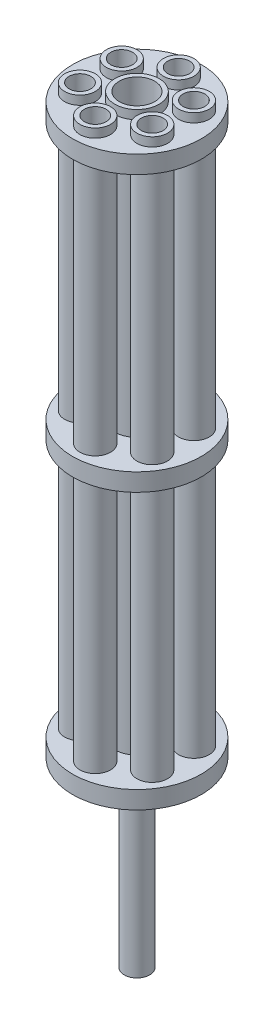
ISO-10303-21;
HEADER;
FILE_DESCRIPTION(('STEP AP214'),'2;1');
FILE_NAME('part.step','',(''),(''),'','','');
FILE_SCHEMA(('AUTOMOTIVE_DESIGN { 1 0 10303 214 1 1 1 1 }'));
ENDSEC;
DATA;
#1=APPLICATION_CONTEXT('core data for automotive mechanical design processes');
#2=APPLICATION_PROTOCOL_DEFINITION('international standard','automotive_design',2000,#1);
#3=PRODUCT_CONTEXT('',#1,'mechanical');
#4=PRODUCT('Part','Part','',(#3));
#5=PRODUCT_RELATED_PRODUCT_CATEGORY('part','',(#4));
#6=PRODUCT_DEFINITION_FORMATION('','',#4);
#7=PRODUCT_DEFINITION_CONTEXT('part definition',#1,'design');
#8=PRODUCT_DEFINITION('design','',#6,#7);
#9=PRODUCT_DEFINITION_SHAPE('','',#8);
#10=(LENGTH_UNIT() NAMED_UNIT(*) SI_UNIT(.MILLI.,.METRE.));
#11=(NAMED_UNIT(*) PLANE_ANGLE_UNIT() SI_UNIT($,.RADIAN.));
#12=(NAMED_UNIT(*) SI_UNIT($,.STERADIAN.) SOLID_ANGLE_UNIT());
#13=UNCERTAINTY_MEASURE_WITH_UNIT(LENGTH_MEASURE(1.E-05),#10,'distance_accuracy_value','');
#14=(GEOMETRIC_REPRESENTATION_CONTEXT(3) GLOBAL_UNCERTAINTY_ASSIGNED_CONTEXT((#13)) GLOBAL_UNIT_ASSIGNED_CONTEXT((#10,
#11,#12)) REPRESENTATION_CONTEXT('',''));
#15=CARTESIAN_POINT('',(0.,0.,0.));
#16=DIRECTION('',(0.,0.,1.));
#17=DIRECTION('',(1.,0.,0.));
#18=AXIS2_PLACEMENT_3D('',#15,#16,#17);
#19=CARTESIAN_POINT('',(0.,-120.,0.));
#20=DIRECTION('',(0.,1.,0.));
#21=DIRECTION('',(0.,0.,1.));
#22=AXIS2_PLACEMENT_3D('',#19,#20,#21);
#23=PLANE('',#22);
#24=CARTESIAN_POINT('',(0.,-120.,0.));
#25=DIRECTION('',(0.,1.,0.));
#26=DIRECTION('',(0.,0.,1.));
#27=AXIS2_PLACEMENT_3D('',#24,#25,#26);
#28=CIRCLE('',#27,4.);
#29=CARTESIAN_POINT('',(0.,-120.,4.));
#30=VERTEX_POINT('',#29);
#31=EDGE_CURVE('E126',#30,#30,#28,.F.);
#32=ORIENTED_EDGE('',*,*,#31,.F.);
#33=EDGE_LOOP('',(#32));
#34=FACE_BOUND('',#33,.T.);
#35=ADVANCED_FACE('F42',(#34),#23,.T.);
#36=CARTESIAN_POINT('',(0.,-121.,0.));
#37=DIRECTION('',(0.,1.,0.));
#38=DIRECTION('',(0.,0.,1.));
#39=AXIS2_PLACEMENT_3D('',#36,#37,#38);
#40=CYLINDRICAL_SURFACE('',#39,4.);
#41=ORIENTED_EDGE('',*,*,#31,.T.);
#42=EDGE_LOOP('',(#41));
#43=FACE_BOUND('',#42,.T.);
#44=CARTESIAN_POINT('',(0.,6.,0.));
#45=DIRECTION('',(0.,1.,0.));
#46=DIRECTION('',(0.,0.,1.));
#47=AXIS2_PLACEMENT_3D('',#44,#45,#46);
#48=CIRCLE('',#47,4.);
#49=CARTESIAN_POINT('',(0.,6.,4.));
#50=VERTEX_POINT('',#49);
#51=EDGE_CURVE('E303',#50,#50,#48,.T.);
#52=ORIENTED_EDGE('',*,*,#51,.T.);
#53=EDGE_LOOP('',(#52));
#54=FACE_BOUND('',#53,.T.);
#55=ADVANCED_FACE('F371',(#43,#54),#40,.F.);
#56=CARTESIAN_POINT('',(0.,4.,0.));
#57=DIRECTION('',(0.,-1.,0.));
#58=DIRECTION('',(0.,0.,-1.));
#59=AXIS2_PLACEMENT_3D('',#56,#57,#58);
#60=CYLINDRICAL_SURFACE('',#59,14.5);
#61=CARTESIAN_POINT('',(0.,4.,0.));
#62=DIRECTION('',(0.,1.,0.));
#63=DIRECTION('',(0.,0.,1.));
#64=AXIS2_PLACEMENT_3D('',#61,#62,#63);
#65=CIRCLE('',#64,14.5);
#66=CARTESIAN_POINT('',(0.,4.,14.5));
#67=VERTEX_POINT('',#66);
#68=EDGE_CURVE('E315',#67,#67,#65,.T.);
#69=ORIENTED_EDGE('',*,*,#68,.F.);
#70=EDGE_LOOP('',(#69));
#71=FACE_BOUND('',#70,.T.);
#72=CARTESIAN_POINT('',(0.,0.,0.));
#73=DIRECTION('',(0.,1.,0.));
#74=DIRECTION('',(0.,0.,1.));
#75=AXIS2_PLACEMENT_3D('',#72,#73,#74);
#76=CIRCLE('',#75,14.5);
#77=CARTESIAN_POINT('',(0.,0.,14.5));
#78=VERTEX_POINT('',#77);
#79=EDGE_CURVE('E319',#78,#78,#76,.T.);
#80=ORIENTED_EDGE('',*,*,#79,.T.);
#81=EDGE_LOOP('',(#80));
#82=FACE_BOUND('',#81,.T.);
#83=ADVANCED_FACE('F44',(#71,#82),#60,.T.);
#84=CARTESIAN_POINT('',(0.,4.,0.));
#85=DIRECTION('',(0.,1.,0.));
#86=DIRECTION('',(0.,0.,1.));
#87=AXIS2_PLACEMENT_3D('',#84,#85,#86);
#88=PLANE('',#87);
#89=CARTESIAN_POINT('',(-8.14063879557373,4.,-4.69999999999999));
#90=DIRECTION('',(0.,1.,0.));
#91=DIRECTION('',(0.,0.,1.));
#92=AXIS2_PLACEMENT_3D('',#89,#90,#91);
#93=CIRCLE('',#92,3.45389241373698);
#94=CARTESIAN_POINT('',(-8.14063879557373,4.,-1.24610758626301));
#95=VERTEX_POINT('',#94);
#96=EDGE_CURVE('E203',#95,#95,#93,.T.);
#97=ORIENTED_EDGE('',*,*,#96,.F.);
#98=EDGE_LOOP('',(#97));
#99=FACE_BOUND('',#98,.T.);
#100=CARTESIAN_POINT('',(-8.14063879557372,4.,4.7));
#101=DIRECTION('',(0.,1.,0.));
#102=DIRECTION('',(0.,0.,1.));
#103=AXIS2_PLACEMENT_3D('',#100,#101,#102);
#104=CIRCLE('',#103,3.45389241373698);
#105=CARTESIAN_POINT('',(-8.14063879557372,4.,8.15389241373698));
#106=VERTEX_POINT('',#105);
#107=EDGE_CURVE('E237',#106,#106,#104,.T.);
#108=ORIENTED_EDGE('',*,*,#107,.F.);
#109=EDGE_LOOP('',(#108));
#110=FACE_BOUND('',#109,.T.);
#111=CARTESIAN_POINT('',(0.,4.,9.4));
#112=DIRECTION('',(0.,1.,0.));
#113=DIRECTION('',(0.,0.,1.));
#114=AXIS2_PLACEMENT_3D('',#111,#112,#113);
#115=CIRCLE('',#114,3.45389241373698);
#116=CARTESIAN_POINT('',(0.,4.,12.853892413737));
#117=VERTEX_POINT('',#116);
#118=EDGE_CURVE('E250',#117,#117,#115,.T.);
#119=ORIENTED_EDGE('',*,*,#118,.F.);
#120=EDGE_LOOP('',(#119));
#121=FACE_BOUND('',#120,.T.);
#122=CARTESIAN_POINT('',(8.14063879557373,4.,4.7));
#123=DIRECTION('',(0.,1.,0.));
#124=DIRECTION('',(0.,0.,1.));
#125=AXIS2_PLACEMENT_3D('',#122,#123,#124);
#126=CIRCLE('',#125,3.45389241373698);
#127=CARTESIAN_POINT('',(8.14063879557373,4.,8.15389241373698));
#128=VERTEX_POINT('',#127);
#129=EDGE_CURVE('E263',#128,#128,#126,.T.);
#130=ORIENTED_EDGE('',*,*,#129,.F.);
#131=EDGE_LOOP('',(#130));
#132=FACE_BOUND('',#131,.T.);
#133=CARTESIAN_POINT('',(8.14063879557373,4.,-4.70000000000001));
#134=DIRECTION('',(0.,1.,0.));
#135=DIRECTION('',(0.,0.,1.));
#136=AXIS2_PLACEMENT_3D('',#133,#134,#135);
#137=CIRCLE('',#136,3.45389241373698);
#138=CARTESIAN_POINT('',(8.14063879557373,4.,-1.24610758626303));
#139=VERTEX_POINT('',#138);
#140=EDGE_CURVE('E276',#139,#139,#137,.T.);
#141=ORIENTED_EDGE('',*,*,#140,.F.);
#142=EDGE_LOOP('',(#141));
#143=FACE_BOUND('',#142,.T.);
#144=CARTESIAN_POINT('',(0.,4.,-9.4));
#145=DIRECTION('',(0.,1.,0.));
#146=DIRECTION('',(0.,0.,1.));
#147=AXIS2_PLACEMENT_3D('',#144,#145,#146);
#148=CIRCLE('',#147,3.45389241373698);
#149=CARTESIAN_POINT('',(0.,4.,-5.94610758626302));
#150=VERTEX_POINT('',#149);
#151=EDGE_CURVE('E289',#150,#150,#148,.T.);
#152=ORIENTED_EDGE('',*,*,#151,.F.);
#153=EDGE_LOOP('',(#152));
#154=FACE_BOUND('',#153,.T.);
#155=CARTESIAN_POINT('',(0.,4.,0.));
#156=DIRECTION('',(0.,1.,0.));
#157=DIRECTION('',(0.,0.,1.));
#158=AXIS2_PLACEMENT_3D('',#155,#156,#157);
#159=CIRCLE('',#158,5.);
#160=CARTESIAN_POINT('',(0.,4.,5.));
#161=VERTEX_POINT('',#160);
#162=EDGE_CURVE('E302',#161,#161,#159,.T.);
#163=ORIENTED_EDGE('',*,*,#162,.F.);
#164=EDGE_LOOP('',(#163));
#165=FACE_BOUND('',#164,.T.);
#166=ORIENTED_EDGE('',*,*,#68,.T.);
#167=EDGE_LOOP('',(#166));
#168=FACE_BOUND('',#167,.T.);
#169=ADVANCED_FACE('F461',(#99,#110,#121,#132,#143,#154,#165,#168),#88,.T.);
#170=CARTESIAN_POINT('',(0.,0.,0.));
#171=DIRECTION('',(0.,1.,0.));
#172=DIRECTION('',(0.,0.,1.));
#173=AXIS2_PLACEMENT_3D('',#170,#171,#172);
#174=PLANE('',#173);
#175=CARTESIAN_POINT('',(-8.14063879557373,0.,-4.69999999999999));
#176=DIRECTION('',(0.,1.,0.));
#177=DIRECTION('',(0.,0.,1.));
#178=AXIS2_PLACEMENT_3D('',#175,#176,#177);
#179=CIRCLE('',#178,3.45389241373698);
#180=CARTESIAN_POINT('',(-8.14063879557373,0.,-1.24610758626301));
#181=VERTEX_POINT('',#180);
#182=EDGE_CURVE('E233',#181,#181,#179,.T.);
#183=ORIENTED_EDGE('',*,*,#182,.T.);
#184=EDGE_LOOP('',(#183));
#185=FACE_BOUND('',#184,.T.);
#186=CARTESIAN_POINT('',(-8.14063879557372,0.,4.7));
#187=DIRECTION('',(0.,1.,0.));
#188=DIRECTION('',(0.,0.,1.));
#189=AXIS2_PLACEMENT_3D('',#186,#187,#188);
#190=CIRCLE('',#189,3.45389241373698);
#191=CARTESIAN_POINT('',(-8.14063879557372,0.,8.15389241373698));
#192=VERTEX_POINT('',#191);
#193=EDGE_CURVE('E246',#192,#192,#190,.T.);
#194=ORIENTED_EDGE('',*,*,#193,.T.);
#195=EDGE_LOOP('',(#194));
#196=FACE_BOUND('',#195,.T.);
#197=CARTESIAN_POINT('',(0.,0.,9.4));
#198=DIRECTION('',(0.,1.,0.));
#199=DIRECTION('',(0.,0.,1.));
#200=AXIS2_PLACEMENT_3D('',#197,#198,#199);
#201=CIRCLE('',#200,3.45389241373698);
#202=CARTESIAN_POINT('',(0.,0.,12.853892413737));
#203=VERTEX_POINT('',#202);
#204=EDGE_CURVE('E259',#203,#203,#201,.T.);
#205=ORIENTED_EDGE('',*,*,#204,.T.);
#206=EDGE_LOOP('',(#205));
#207=FACE_BOUND('',#206,.T.);
#208=CARTESIAN_POINT('',(8.14063879557373,0.,4.7));
#209=DIRECTION('',(0.,1.,0.));
#210=DIRECTION('',(0.,0.,1.));
#211=AXIS2_PLACEMENT_3D('',#208,#209,#210);
#212=CIRCLE('',#211,3.45389241373698);
#213=CARTESIAN_POINT('',(8.14063879557373,0.,8.15389241373698));
#214=VERTEX_POINT('',#213);
#215=EDGE_CURVE('E272',#214,#214,#212,.T.);
#216=ORIENTED_EDGE('',*,*,#215,.T.);
#217=EDGE_LOOP('',(#216));
#218=FACE_BOUND('',#217,.T.);
#219=CARTESIAN_POINT('',(8.14063879557373,0.,-4.70000000000001));
#220=DIRECTION('',(0.,1.,0.));
#221=DIRECTION('',(0.,0.,1.));
#222=AXIS2_PLACEMENT_3D('',#219,#220,#221);
#223=CIRCLE('',#222,3.45389241373698);
#224=CARTESIAN_POINT('',(8.14063879557373,0.,-1.24610758626303));
#225=VERTEX_POINT('',#224);
#226=EDGE_CURVE('E285',#225,#225,#223,.T.);
#227=ORIENTED_EDGE('',*,*,#226,.T.);
#228=EDGE_LOOP('',(#227));
#229=FACE_BOUND('',#228,.T.);
#230=CARTESIAN_POINT('',(0.,0.,-9.4));
#231=DIRECTION('',(0.,1.,0.));
#232=DIRECTION('',(0.,0.,1.));
#233=AXIS2_PLACEMENT_3D('',#230,#231,#232);
#234=CIRCLE('',#233,3.45389241373698);
#235=CARTESIAN_POINT('',(0.,0.,-5.94610758626302));
#236=VERTEX_POINT('',#235);
#237=EDGE_CURVE('E298',#236,#236,#234,.T.);
#238=ORIENTED_EDGE('',*,*,#237,.T.);
#239=EDGE_LOOP('',(#238));
#240=FACE_BOUND('',#239,.T.);
#241=CARTESIAN_POINT('',(0.,0.,0.));
#242=DIRECTION('',(0.,1.,0.));
#243=DIRECTION('',(0.,0.,1.));
#244=AXIS2_PLACEMENT_3D('',#241,#242,#243);
#245=CIRCLE('',#244,5.);
#246=CARTESIAN_POINT('',(0.,0.,5.));
#247=VERTEX_POINT('',#246);
#248=EDGE_CURVE('E311',#247,#247,#245,.T.);
#249=ORIENTED_EDGE('',*,*,#248,.T.);
#250=EDGE_LOOP('',(#249));
#251=FACE_BOUND('',#250,.T.);
#252=ORIENTED_EDGE('',*,*,#79,.F.);
#253=EDGE_LOOP('',(#252));
#254=FACE_BOUND('',#253,.T.);
#255=ADVANCED_FACE('F344',(#185,#196,#207,#218,#229,#240,#251,#254),#174,.F.);
#256=CARTESIAN_POINT('',(0.,-121.,0.));
#257=DIRECTION('',(0.,1.,0.));
#258=DIRECTION('',(0.,0.,1.));
#259=AXIS2_PLACEMENT_3D('',#256,#257,#258);
#260=CYLINDRICAL_SURFACE('',#259,5.);
#261=CARTESIAN_POINT('',(0.,-58.,0.));
#262=DIRECTION('',(0.,1.,0.));
#263=DIRECTION('',(0.,0.,1.));
#264=AXIS2_PLACEMENT_3D('',#261,#262,#263);
#265=CIRCLE('',#264,5.);
#266=CARTESIAN_POINT('',(0.,-58.,5.));
#267=VERTEX_POINT('',#266);
#268=EDGE_CURVE('E135',#267,#267,#265,.F.);
#269=ORIENTED_EDGE('',*,*,#268,.F.);
#270=EDGE_LOOP('',(#269));
#271=FACE_BOUND('',#270,.T.);
#272=ORIENTED_EDGE('',*,*,#248,.F.);
#273=EDGE_LOOP('',(#272));
#274=FACE_BOUND('',#273,.T.);
#275=ADVANCED_FACE('F460',(#271,#274),#260,.T.);
#276=ORIENTED_EDGE('',*,*,#162,.T.);
#277=EDGE_LOOP('',(#276));
#278=FACE_BOUND('',#277,.T.);
#279=CARTESIAN_POINT('',(0.,6.,0.));
#280=DIRECTION('',(0.,1.,0.));
#281=DIRECTION('',(0.,0.,1.));
#282=AXIS2_PLACEMENT_3D('',#279,#280,#281);
#283=CIRCLE('',#282,5.);
#284=CARTESIAN_POINT('',(0.,6.,5.));
#285=VERTEX_POINT('',#284);
#286=EDGE_CURVE('E307',#285,#285,#283,.T.);
#287=ORIENTED_EDGE('',*,*,#286,.F.);
#288=EDGE_LOOP('',(#287));
#289=FACE_BOUND('',#288,.T.);
#290=ADVANCED_FACE('F488',(#278,#289),#260,.T.);
#291=CARTESIAN_POINT('',(0.,6.,0.));
#292=DIRECTION('',(0.,1.,0.));
#293=DIRECTION('',(0.,0.,1.));
#294=AXIS2_PLACEMENT_3D('',#291,#292,#293);
#295=PLANE('',#294);
#296=ORIENTED_EDGE('',*,*,#286,.T.);
#297=EDGE_LOOP('',(#296));
#298=FACE_BOUND('',#297,.T.);
#299=ORIENTED_EDGE('',*,*,#51,.F.);
#300=EDGE_LOOP('',(#299));
#301=FACE_BOUND('',#300,.T.);
#302=ADVANCED_FACE('F490',(#298,#301),#295,.T.);
#303=CARTESIAN_POINT('',(0.,-121.,-9.4));
#304=DIRECTION('',(0.,1.,0.));
#305=DIRECTION('',(0.,0.,1.));
#306=AXIS2_PLACEMENT_3D('',#303,#304,#305);
#307=CYLINDRICAL_SURFACE('',#306,3.45389241373698);
#308=CARTESIAN_POINT('',(0.,-58.,-9.4));
#309=DIRECTION('',(0.,1.,0.));
#310=DIRECTION('',(0.,0.,1.));
#311=AXIS2_PLACEMENT_3D('',#308,#309,#310);
#312=CIRCLE('',#311,3.45389241373698);
#313=CARTESIAN_POINT('',(0.,-58.,-5.94610758626302));
#314=VERTEX_POINT('',#313);
#315=EDGE_CURVE('E219',#314,#314,#312,.F.);
#316=ORIENTED_EDGE('',*,*,#315,.F.);
#317=EDGE_LOOP('',(#316));
#318=FACE_BOUND('',#317,.T.);
#319=ORIENTED_EDGE('',*,*,#237,.F.);
#320=EDGE_LOOP('',(#319));
#321=FACE_BOUND('',#320,.T.);
#322=ADVANCED_FACE('F495',(#318,#321),#307,.T.);
#323=ORIENTED_EDGE('',*,*,#151,.T.);
#324=EDGE_LOOP('',(#323));
#325=FACE_BOUND('',#324,.T.);
#326=CARTESIAN_POINT('',(0.,6.,-9.4));
#327=DIRECTION('',(0.,1.,0.));
#328=DIRECTION('',(0.,0.,1.));
#329=AXIS2_PLACEMENT_3D('',#326,#327,#328);
#330=CIRCLE('',#329,3.45389241373698);
#331=CARTESIAN_POINT('',(0.,6.,-5.94610758626302));
#332=VERTEX_POINT('',#331);
#333=EDGE_CURVE('E290',#332,#332,#330,.T.);
#334=ORIENTED_EDGE('',*,*,#333,.F.);
#335=EDGE_LOOP('',(#334));
#336=FACE_BOUND('',#335,.T.);
#337=ADVANCED_FACE('F501',(#325,#336),#307,.T.);
#338=CARTESIAN_POINT('',(0.,6.,-9.4));
#339=DIRECTION('',(0.,1.,0.));
#340=DIRECTION('',(0.,0.,1.));
#341=AXIS2_PLACEMENT_3D('',#338,#339,#340);
#342=PLANE('',#341);
#343=ORIENTED_EDGE('',*,*,#333,.T.);
#344=EDGE_LOOP('',(#343));
#345=FACE_BOUND('',#344,.T.);
#346=CARTESIAN_POINT('',(0.,6.,-9.4));
#347=DIRECTION('',(0.,1.,0.));
#348=DIRECTION('',(0.,0.,1.));
#349=AXIS2_PLACEMENT_3D('',#346,#347,#348);
#350=CIRCLE('',#349,2.45389241373698);
#351=CARTESIAN_POINT('',(0.,6.,-6.94610758626302));
#352=VERTEX_POINT('',#351);
#353=EDGE_CURVE('E294',#352,#352,#350,.T.);
#354=ORIENTED_EDGE('',*,*,#353,.F.);
#355=EDGE_LOOP('',(#354));
#356=FACE_BOUND('',#355,.T.);
#357=ADVANCED_FACE('F497',(#345,#356),#342,.T.);
#358=CARTESIAN_POINT('',(8.14063879557373,-121.,-4.70000000000001));
#359=DIRECTION('',(0.,1.,0.));
#360=DIRECTION('',(0.,0.,1.));
#361=AXIS2_PLACEMENT_3D('',#358,#359,#360);
#362=CYLINDRICAL_SURFACE('',#361,3.45389241373698);
#363=CARTESIAN_POINT('',(8.14063879557373,-58.,-4.70000000000001));
#364=DIRECTION('',(0.,1.,0.));
#365=DIRECTION('',(0.,0.,1.));
#366=AXIS2_PLACEMENT_3D('',#363,#364,#365);
#367=CIRCLE('',#366,3.45389241373698);
#368=CARTESIAN_POINT('',(8.14063879557373,-58.,-1.24610758626303));
#369=VERTEX_POINT('',#368);
#370=EDGE_CURVE('E215',#369,#369,#367,.F.);
#371=ORIENTED_EDGE('',*,*,#370,.F.);
#372=EDGE_LOOP('',(#371));
#373=FACE_BOUND('',#372,.T.);
#374=ORIENTED_EDGE('',*,*,#226,.F.);
#375=EDGE_LOOP('',(#374));
#376=FACE_BOUND('',#375,.T.);
#377=ADVANCED_FACE('F500',(#373,#376),#362,.T.);
#378=ORIENTED_EDGE('',*,*,#140,.T.);
#379=EDGE_LOOP('',(#378));
#380=FACE_BOUND('',#379,.T.);
#381=CARTESIAN_POINT('',(8.14063879557373,6.,-4.70000000000001));
#382=DIRECTION('',(0.,1.,0.));
#383=DIRECTION('',(0.,0.,1.));
#384=AXIS2_PLACEMENT_3D('',#381,#382,#383);
#385=CIRCLE('',#384,3.45389241373698);
#386=CARTESIAN_POINT('',(8.14063879557373,6.,-1.24610758626303));
#387=VERTEX_POINT('',#386);
#388=EDGE_CURVE('E277',#387,#387,#385,.T.);
#389=ORIENTED_EDGE('',*,*,#388,.F.);
#390=EDGE_LOOP('',(#389));
#391=FACE_BOUND('',#390,.T.);
#392=ADVANCED_FACE('F517',(#380,#391),#362,.T.);
#393=CARTESIAN_POINT('',(8.14063879557373,6.,-4.70000000000001));
#394=DIRECTION('',(0.,1.,0.));
#395=DIRECTION('',(0.,0.,1.));
#396=AXIS2_PLACEMENT_3D('',#393,#394,#395);
#397=PLANE('',#396);
#398=ORIENTED_EDGE('',*,*,#388,.T.);
#399=EDGE_LOOP('',(#398));
#400=FACE_BOUND('',#399,.T.);
#401=CARTESIAN_POINT('',(8.14063879557373,6.,-4.70000000000001));
#402=DIRECTION('',(0.,1.,0.));
#403=DIRECTION('',(0.,0.,1.));
#404=AXIS2_PLACEMENT_3D('',#401,#402,#403);
#405=CIRCLE('',#404,2.45389241373698);
#406=CARTESIAN_POINT('',(8.14063879557373,6.,-2.24610758626303));
#407=VERTEX_POINT('',#406);
#408=EDGE_CURVE('E281',#407,#407,#405,.T.);
#409=ORIENTED_EDGE('',*,*,#408,.F.);
#410=EDGE_LOOP('',(#409));
#411=FACE_BOUND('',#410,.T.);
#412=ADVANCED_FACE('F513',(#400,#411),#397,.T.);
#413=CARTESIAN_POINT('',(8.14063879557373,-121.,4.7));
#414=DIRECTION('',(0.,1.,0.));
#415=DIRECTION('',(0.,0.,1.));
#416=AXIS2_PLACEMENT_3D('',#413,#414,#415);
#417=CYLINDRICAL_SURFACE('',#416,3.45389241373698);
#418=CARTESIAN_POINT('',(8.14063879557373,-58.,4.7));
#419=DIRECTION('',(0.,1.,0.));
#420=DIRECTION('',(0.,0.,1.));
#421=AXIS2_PLACEMENT_3D('',#418,#419,#420);
#422=CIRCLE('',#421,3.45389241373698);
#423=CARTESIAN_POINT('',(8.14063879557373,-58.,8.15389241373698));
#424=VERTEX_POINT('',#423);
#425=EDGE_CURVE('E211',#424,#424,#422,.F.);
#426=ORIENTED_EDGE('',*,*,#425,.F.);
#427=EDGE_LOOP('',(#426));
#428=FACE_BOUND('',#427,.T.);
#429=ORIENTED_EDGE('',*,*,#215,.F.);
#430=EDGE_LOOP('',(#429));
#431=FACE_BOUND('',#430,.T.);
#432=ADVANCED_FACE('F516',(#428,#431),#417,.T.);
#433=ORIENTED_EDGE('',*,*,#129,.T.);
#434=EDGE_LOOP('',(#433));
#435=FACE_BOUND('',#434,.T.);
#436=CARTESIAN_POINT('',(8.14063879557373,6.,4.7));
#437=DIRECTION('',(0.,1.,0.));
#438=DIRECTION('',(0.,0.,1.));
#439=AXIS2_PLACEMENT_3D('',#436,#437,#438);
#440=CIRCLE('',#439,3.45389241373698);
#441=CARTESIAN_POINT('',(8.14063879557373,6.,8.15389241373698));
#442=VERTEX_POINT('',#441);
#443=EDGE_CURVE('E264',#442,#442,#440,.T.);
#444=ORIENTED_EDGE('',*,*,#443,.F.);
#445=EDGE_LOOP('',(#444));
#446=FACE_BOUND('',#445,.T.);
#447=ADVANCED_FACE('F531',(#435,#446),#417,.T.);
#448=CARTESIAN_POINT('',(8.14063879557373,6.,4.7));
#449=DIRECTION('',(0.,1.,0.));
#450=DIRECTION('',(0.,0.,1.));
#451=AXIS2_PLACEMENT_3D('',#448,#449,#450);
#452=PLANE('',#451);
#453=ORIENTED_EDGE('',*,*,#443,.T.);
#454=EDGE_LOOP('',(#453));
#455=FACE_BOUND('',#454,.T.);
#456=CARTESIAN_POINT('',(8.14063879557373,6.,4.7));
#457=DIRECTION('',(0.,1.,0.));
#458=DIRECTION('',(0.,0.,1.));
#459=AXIS2_PLACEMENT_3D('',#456,#457,#458);
#460=CIRCLE('',#459,2.45389241373698);
#461=CARTESIAN_POINT('',(8.14063879557373,6.,7.15389241373698));
#462=VERTEX_POINT('',#461);
#463=EDGE_CURVE('E268',#462,#462,#460,.T.);
#464=ORIENTED_EDGE('',*,*,#463,.F.);
#465=EDGE_LOOP('',(#464));
#466=FACE_BOUND('',#465,.T.);
#467=ADVANCED_FACE('F527',(#455,#466),#452,.T.);
#468=CARTESIAN_POINT('',(0.,-121.,9.4));
#469=DIRECTION('',(0.,1.,0.));
#470=DIRECTION('',(0.,0.,1.));
#471=AXIS2_PLACEMENT_3D('',#468,#469,#470);
#472=CYLINDRICAL_SURFACE('',#471,3.45389241373698);
#473=CARTESIAN_POINT('',(0.,-58.,9.4));
#474=DIRECTION('',(0.,1.,0.));
#475=DIRECTION('',(0.,0.,1.));
#476=AXIS2_PLACEMENT_3D('',#473,#474,#475);
#477=CIRCLE('',#476,3.45389241373698);
#478=CARTESIAN_POINT('',(0.,-58.,12.853892413737));
#479=VERTEX_POINT('',#478);
#480=EDGE_CURVE('E207',#479,#479,#477,.F.);
#481=ORIENTED_EDGE('',*,*,#480,.F.);
#482=EDGE_LOOP('',(#481));
#483=FACE_BOUND('',#482,.T.);
#484=ORIENTED_EDGE('',*,*,#204,.F.);
#485=EDGE_LOOP('',(#484));
#486=FACE_BOUND('',#485,.T.);
#487=ADVANCED_FACE('F530',(#483,#486),#472,.T.);
#488=ORIENTED_EDGE('',*,*,#118,.T.);
#489=EDGE_LOOP('',(#488));
#490=FACE_BOUND('',#489,.T.);
#491=CARTESIAN_POINT('',(0.,6.,9.4));
#492=DIRECTION('',(0.,1.,0.));
#493=DIRECTION('',(0.,0.,1.));
#494=AXIS2_PLACEMENT_3D('',#491,#492,#493);
#495=CIRCLE('',#494,3.45389241373698);
#496=CARTESIAN_POINT('',(0.,6.,12.853892413737));
#497=VERTEX_POINT('',#496);
#498=EDGE_CURVE('E251',#497,#497,#495,.T.);
#499=ORIENTED_EDGE('',*,*,#498,.F.);
#500=EDGE_LOOP('',(#499));
#501=FACE_BOUND('',#500,.T.);
#502=ADVANCED_FACE('F543',(#490,#501),#472,.T.);
#503=CARTESIAN_POINT('',(0.,6.,9.4));
#504=DIRECTION('',(0.,1.,0.));
#505=DIRECTION('',(0.,0.,1.));
#506=AXIS2_PLACEMENT_3D('',#503,#504,#505);
#507=PLANE('',#506);
#508=ORIENTED_EDGE('',*,*,#498,.T.);
#509=EDGE_LOOP('',(#508));
#510=FACE_BOUND('',#509,.T.);
#511=CARTESIAN_POINT('',(0.,6.,9.4));
#512=DIRECTION('',(0.,1.,0.));
#513=DIRECTION('',(0.,0.,1.));
#514=AXIS2_PLACEMENT_3D('',#511,#512,#513);
#515=CIRCLE('',#514,2.45389241373698);
#516=CARTESIAN_POINT('',(0.,6.,11.853892413737));
#517=VERTEX_POINT('',#516);
#518=EDGE_CURVE('E255',#517,#517,#515,.T.);
#519=ORIENTED_EDGE('',*,*,#518,.F.);
#520=EDGE_LOOP('',(#519));
#521=FACE_BOUND('',#520,.T.);
#522=ADVANCED_FACE('F456',(#510,#521),#507,.T.);
#523=CARTESIAN_POINT('',(-8.14063879557372,-121.,4.7));
#524=DIRECTION('',(0.,1.,0.));
#525=DIRECTION('',(0.,0.,1.));
#526=AXIS2_PLACEMENT_3D('',#523,#524,#525);
#527=CYLINDRICAL_SURFACE('',#526,3.45389241373698);
#528=CARTESIAN_POINT('',(-8.14063879557372,-58.,4.7));
#529=DIRECTION('',(0.,1.,0.));
#530=DIRECTION('',(0.,0.,1.));
#531=AXIS2_PLACEMENT_3D('',#528,#529,#530);
#532=CIRCLE('',#531,3.45389241373698);
#533=CARTESIAN_POINT('',(-8.14063879557372,-58.,8.15389241373698));
#534=VERTEX_POINT('',#533);
#535=EDGE_CURVE('E202',#534,#534,#532,.F.);
#536=ORIENTED_EDGE('',*,*,#535,.F.);
#537=EDGE_LOOP('',(#536));
#538=FACE_BOUND('',#537,.T.);
#539=ORIENTED_EDGE('',*,*,#193,.F.);
#540=EDGE_LOOP('',(#539));
#541=FACE_BOUND('',#540,.T.);
#542=ADVANCED_FACE('F434',(#538,#541),#527,.T.);
#543=ORIENTED_EDGE('',*,*,#107,.T.);
#544=EDGE_LOOP('',(#543));
#545=FACE_BOUND('',#544,.T.);
#546=CARTESIAN_POINT('',(-8.14063879557372,6.,4.7));
#547=DIRECTION('',(0.,1.,0.));
#548=DIRECTION('',(0.,0.,1.));
#549=AXIS2_PLACEMENT_3D('',#546,#547,#548);
#550=CIRCLE('',#549,3.45389241373698);
#551=CARTESIAN_POINT('',(-8.14063879557372,6.,8.15389241373698));
#552=VERTEX_POINT('',#551);
#553=EDGE_CURVE('E238',#552,#552,#550,.T.);
#554=ORIENTED_EDGE('',*,*,#553,.F.);
#555=EDGE_LOOP('',(#554));
#556=FACE_BOUND('',#555,.T.);
#557=ADVANCED_FACE('F360',(#545,#556),#527,.T.);
#558=CARTESIAN_POINT('',(-8.14063879557372,6.,4.7));
#559=DIRECTION('',(0.,1.,0.));
#560=DIRECTION('',(0.,0.,1.));
#561=AXIS2_PLACEMENT_3D('',#558,#559,#560);
#562=PLANE('',#561);
#563=ORIENTED_EDGE('',*,*,#553,.T.);
#564=EDGE_LOOP('',(#563));
#565=FACE_BOUND('',#564,.T.);
#566=CARTESIAN_POINT('',(-8.14063879557372,6.,4.7));
#567=DIRECTION('',(0.,1.,0.));
#568=DIRECTION('',(0.,0.,1.));
#569=AXIS2_PLACEMENT_3D('',#566,#567,#568);
#570=CIRCLE('',#569,2.45389241373698);
#571=CARTESIAN_POINT('',(-8.14063879557372,6.,7.15389241373698));
#572=VERTEX_POINT('',#571);
#573=EDGE_CURVE('E242',#572,#572,#570,.T.);
#574=ORIENTED_EDGE('',*,*,#573,.F.);
#575=EDGE_LOOP('',(#574));
#576=FACE_BOUND('',#575,.T.);
#577=ADVANCED_FACE('F350',(#565,#576),#562,.T.);
#578=CARTESIAN_POINT('',(-8.14063879557373,-121.,-4.69999999999999));
#579=DIRECTION('',(0.,1.,0.));
#580=DIRECTION('',(0.,0.,1.));
#581=AXIS2_PLACEMENT_3D('',#578,#579,#580);
#582=CYLINDRICAL_SURFACE('',#581,3.45389241373698);
#583=CARTESIAN_POINT('',(-8.14063879557373,-58.,-4.69999999999999));
#584=DIRECTION('',(0.,1.,0.));
#585=DIRECTION('',(0.,0.,1.));
#586=AXIS2_PLACEMENT_3D('',#583,#584,#585);
#587=CIRCLE('',#586,3.45389241373698);
#588=CARTESIAN_POINT('',(-8.14063879557373,-58.,-1.24610758626301));
#589=VERTEX_POINT('',#588);
#590=EDGE_CURVE('E198',#589,#589,#587,.F.);
#591=ORIENTED_EDGE('',*,*,#590,.F.);
#592=EDGE_LOOP('',(#591));
#593=FACE_BOUND('',#592,.T.);
#594=ORIENTED_EDGE('',*,*,#182,.F.);
#595=EDGE_LOOP('',(#594));
#596=FACE_BOUND('',#595,.T.);
#597=ADVANCED_FACE('F347',(#593,#596),#582,.T.);
#598=ORIENTED_EDGE('',*,*,#96,.T.);
#599=EDGE_LOOP('',(#598));
#600=FACE_BOUND('',#599,.T.);
#601=CARTESIAN_POINT('',(-8.14063879557373,6.,-4.69999999999999));
#602=DIRECTION('',(0.,1.,0.));
#603=DIRECTION('',(0.,0.,1.));
#604=AXIS2_PLACEMENT_3D('',#601,#602,#603);
#605=CIRCLE('',#604,3.45389241373698);
#606=CARTESIAN_POINT('',(-8.14063879557373,6.,-1.24610758626301));
#607=VERTEX_POINT('',#606);
#608=EDGE_CURVE('E197',#607,#607,#605,.T.);
#609=ORIENTED_EDGE('',*,*,#608,.F.);
#610=EDGE_LOOP('',(#609));
#611=FACE_BOUND('',#610,.T.);
#612=ADVANCED_FACE('F349',(#600,#611),#582,.T.);
#613=CARTESIAN_POINT('',(-8.14063879557373,6.,-4.69999999999999));
#614=DIRECTION('',(0.,1.,0.));
#615=DIRECTION('',(0.,0.,1.));
#616=AXIS2_PLACEMENT_3D('',#613,#614,#615);
#617=PLANE('',#616);
#618=ORIENTED_EDGE('',*,*,#608,.T.);
#619=EDGE_LOOP('',(#618));
#620=FACE_BOUND('',#619,.T.);
#621=CARTESIAN_POINT('',(-8.14063879557373,6.,-4.69999999999999));
#622=DIRECTION('',(0.,1.,0.));
#623=DIRECTION('',(0.,0.,1.));
#624=AXIS2_PLACEMENT_3D('',#621,#622,#623);
#625=CIRCLE('',#624,2.45389241373698);
#626=CARTESIAN_POINT('',(-8.14063879557373,6.,-2.24610758626301));
#627=VERTEX_POINT('',#626);
#628=EDGE_CURVE('E229',#627,#627,#625,.T.);
#629=ORIENTED_EDGE('',*,*,#628,.F.);
#630=EDGE_LOOP('',(#629));
#631=FACE_BOUND('',#630,.T.);
#632=ADVANCED_FACE('F358',(#620,#631),#617,.T.);
#633=CARTESIAN_POINT('',(0.,-62.,0.));
#634=DIRECTION('',(0.,1.,0.));
#635=DIRECTION('',(0.,0.,1.));
#636=AXIS2_PLACEMENT_3D('',#633,#634,#635);
#637=PLANE('',#636);
#638=CARTESIAN_POINT('',(0.,-62.,0.));
#639=DIRECTION('',(0.,1.,0.));
#640=DIRECTION('',(0.,0.,1.));
#641=AXIS2_PLACEMENT_3D('',#638,#639,#640);
#642=CIRCLE('',#641,5.);
#643=CARTESIAN_POINT('',(0.,-62.,5.));
#644=VERTEX_POINT('',#643);
#645=EDGE_CURVE('E193',#644,#644,#642,.F.);
#646=ORIENTED_EDGE('',*,*,#645,.F.);
#647=EDGE_LOOP('',(#646));
#648=FACE_BOUND('',#647,.T.);
#649=CARTESIAN_POINT('',(0.,-62.,-9.4));
#650=DIRECTION('',(0.,1.,0.));
#651=DIRECTION('',(0.,0.,1.));
#652=AXIS2_PLACEMENT_3D('',#649,#650,#651);
#653=CIRCLE('',#652,3.45389241373698);
#654=CARTESIAN_POINT('',(0.,-62.,-5.94610758626302));
#655=VERTEX_POINT('',#654);
#656=EDGE_CURVE('E189',#655,#655,#653,.F.);
#657=ORIENTED_EDGE('',*,*,#656,.F.);
#658=EDGE_LOOP('',(#657));
#659=FACE_BOUND('',#658,.T.);
#660=CARTESIAN_POINT('',(8.14063879557373,-62.,-4.70000000000001));
#661=DIRECTION('',(0.,1.,0.));
#662=DIRECTION('',(0.,0.,1.));
#663=AXIS2_PLACEMENT_3D('',#660,#661,#662);
#664=CIRCLE('',#663,3.45389241373698);
#665=CARTESIAN_POINT('',(8.14063879557373,-62.,-1.24610758626303));
#666=VERTEX_POINT('',#665);
#667=EDGE_CURVE('E185',#666,#666,#664,.F.);
#668=ORIENTED_EDGE('',*,*,#667,.F.);
#669=EDGE_LOOP('',(#668));
#670=FACE_BOUND('',#669,.T.);
#671=CARTESIAN_POINT('',(8.14063879557373,-62.,4.7));
#672=DIRECTION('',(0.,1.,0.));
#673=DIRECTION('',(0.,0.,1.));
#674=AXIS2_PLACEMENT_3D('',#671,#672,#673);
#675=CIRCLE('',#674,3.45389241373698);
#676=CARTESIAN_POINT('',(8.14063879557373,-62.,8.15389241373698));
#677=VERTEX_POINT('',#676);
#678=EDGE_CURVE('E181',#677,#677,#675,.F.);
#679=ORIENTED_EDGE('',*,*,#678,.F.);
#680=EDGE_LOOP('',(#679));
#681=FACE_BOUND('',#680,.T.);
#682=CARTESIAN_POINT('',(0.,-62.,9.4));
#683=DIRECTION('',(0.,1.,0.));
#684=DIRECTION('',(0.,0.,1.));
#685=AXIS2_PLACEMENT_3D('',#682,#683,#684);
#686=CIRCLE('',#685,3.45389241373698);
#687=CARTESIAN_POINT('',(0.,-62.,12.853892413737));
#688=VERTEX_POINT('',#687);
#689=EDGE_CURVE('E177',#688,#688,#686,.F.);
#690=ORIENTED_EDGE('',*,*,#689,.F.);
#691=EDGE_LOOP('',(#690));
#692=FACE_BOUND('',#691,.T.);
#693=CARTESIAN_POINT('',(-8.14063879557372,-62.,4.7));
#694=DIRECTION('',(0.,1.,0.));
#695=DIRECTION('',(0.,0.,1.));
#696=AXIS2_PLACEMENT_3D('',#693,#694,#695);
#697=CIRCLE('',#696,3.45389241373698);
#698=CARTESIAN_POINT('',(-8.14063879557372,-62.,8.15389241373698));
#699=VERTEX_POINT('',#698);
#700=EDGE_CURVE('E173',#699,#699,#697,.F.);
#701=ORIENTED_EDGE('',*,*,#700,.F.);
#702=EDGE_LOOP('',(#701));
#703=FACE_BOUND('',#702,.T.);
#704=CARTESIAN_POINT('',(-8.14063879557373,-62.,-4.69999999999999));
#705=DIRECTION('',(0.,1.,0.));
#706=DIRECTION('',(0.,0.,1.));
#707=AXIS2_PLACEMENT_3D('',#704,#705,#706);
#708=CIRCLE('',#707,3.45389241373698);
#709=CARTESIAN_POINT('',(-8.14063879557373,-62.,-1.24610758626301));
#710=VERTEX_POINT('',#709);
#711=EDGE_CURVE('E166',#710,#710,#708,.F.);
#712=ORIENTED_EDGE('',*,*,#711,.F.);
#713=EDGE_LOOP('',(#712));
#714=FACE_BOUND('',#713,.T.);
#715=CARTESIAN_POINT('',(0.,-62.,0.));
#716=DIRECTION('',(0.,1.,0.));
#717=DIRECTION('',(0.,0.,1.));
#718=AXIS2_PLACEMENT_3D('',#715,#716,#717);
#719=CIRCLE('',#718,14.5);
#720=CARTESIAN_POINT('',(0.,-62.,14.5));
#721=VERTEX_POINT('',#720);
#722=EDGE_CURVE('E139',#721,#721,#719,.T.);
#723=ORIENTED_EDGE('',*,*,#722,.F.);
#724=EDGE_LOOP('',(#723));
#725=FACE_BOUND('',#724,.T.);
#726=ADVANCED_FACE('F415',(#648,#659,#670,#681,#692,#703,#714,#725),#637,.F.);
#727=CARTESIAN_POINT('',(0.,-58.,0.));
#728=DIRECTION('',(0.,1.,0.));
#729=DIRECTION('',(0.,0.,1.));
#730=AXIS2_PLACEMENT_3D('',#727,#728,#729);
#731=PLANE('',#730);
#732=ORIENTED_EDGE('',*,*,#268,.T.);
#733=EDGE_LOOP('',(#732));
#734=FACE_BOUND('',#733,.T.);
#735=ORIENTED_EDGE('',*,*,#315,.T.);
#736=EDGE_LOOP('',(#735));
#737=FACE_BOUND('',#736,.T.);
#738=ORIENTED_EDGE('',*,*,#370,.T.);
#739=EDGE_LOOP('',(#738));
#740=FACE_BOUND('',#739,.T.);
#741=ORIENTED_EDGE('',*,*,#425,.T.);
#742=EDGE_LOOP('',(#741));
#743=FACE_BOUND('',#742,.T.);
#744=ORIENTED_EDGE('',*,*,#480,.T.);
#745=EDGE_LOOP('',(#744));
#746=FACE_BOUND('',#745,.T.);
#747=ORIENTED_EDGE('',*,*,#535,.T.);
#748=EDGE_LOOP('',(#747));
#749=FACE_BOUND('',#748,.T.);
#750=ORIENTED_EDGE('',*,*,#590,.T.);
#751=EDGE_LOOP('',(#750));
#752=FACE_BOUND('',#751,.T.);
#753=CARTESIAN_POINT('',(0.,-58.,0.));
#754=DIRECTION('',(0.,1.,0.));
#755=DIRECTION('',(0.,0.,1.));
#756=AXIS2_PLACEMENT_3D('',#753,#754,#755);
#757=CIRCLE('',#756,14.5);
#758=CARTESIAN_POINT('',(0.,-58.,14.5));
#759=VERTEX_POINT('',#758);
#760=EDGE_CURVE('E162',#759,#759,#757,.T.);
#761=ORIENTED_EDGE('',*,*,#760,.T.);
#762=EDGE_LOOP('',(#761));
#763=FACE_BOUND('',#762,.T.);
#764=ADVANCED_FACE('F418',(#734,#737,#740,#743,#746,#749,#752,#763),#731,.T.);
#765=CARTESIAN_POINT('',(0.,-58.,0.));
#766=DIRECTION('',(0.,-1.,0.));
#767=DIRECTION('',(0.,0.,-1.));
#768=AXIS2_PLACEMENT_3D('',#765,#766,#767);
#769=CYLINDRICAL_SURFACE('',#768,14.5);
#770=ORIENTED_EDGE('',*,*,#760,.F.);
#771=EDGE_LOOP('',(#770));
#772=FACE_BOUND('',#771,.T.);
#773=ORIENTED_EDGE('',*,*,#722,.T.);
#774=EDGE_LOOP('',(#773));
#775=FACE_BOUND('',#774,.T.);
#776=ADVANCED_FACE('F423',(#772,#775),#769,.T.);
#777=CARTESIAN_POINT('',(-8.14063879557372,-120.,4.7));
#778=DIRECTION('',(0.,1.,0.));
#779=DIRECTION('',(0.,0.,1.));
#780=AXIS2_PLACEMENT_3D('',#777,#778,#779);
#781=CIRCLE('',#780,3.45389241373698);
#782=CARTESIAN_POINT('',(-8.14063879557372,-120.,8.15389241373698));
#783=VERTEX_POINT('',#782);
#784=EDGE_CURVE('E51',#783,#783,#781,.F.);
#785=ORIENTED_EDGE('',*,*,#784,.F.);
#786=EDGE_LOOP('',(#785));
#787=FACE_BOUND('',#786,.T.);
#788=ORIENTED_EDGE('',*,*,#700,.T.);
#789=EDGE_LOOP('',(#788));
#790=FACE_BOUND('',#789,.T.);
#791=ADVANCED_FACE('F425',(#787,#790),#527,.T.);
#792=CARTESIAN_POINT('',(0.,-120.,9.4));
#793=DIRECTION('',(0.,1.,0.));
#794=DIRECTION('',(0.,0.,1.));
#795=AXIS2_PLACEMENT_3D('',#792,#793,#794);
#796=CIRCLE('',#795,3.45389241373698);
#797=CARTESIAN_POINT('',(0.,-120.,12.853892413737));
#798=VERTEX_POINT('',#797);
#799=EDGE_CURVE('E155',#798,#798,#796,.F.);
#800=ORIENTED_EDGE('',*,*,#799,.F.);
#801=EDGE_LOOP('',(#800));
#802=FACE_BOUND('',#801,.T.);
#803=ORIENTED_EDGE('',*,*,#689,.T.);
#804=EDGE_LOOP('',(#803));
#805=FACE_BOUND('',#804,.T.);
#806=ADVANCED_FACE('F431',(#802,#805),#472,.T.);
#807=CARTESIAN_POINT('',(8.14063879557373,-120.,4.7));
#808=DIRECTION('',(0.,1.,0.));
#809=DIRECTION('',(0.,0.,1.));
#810=AXIS2_PLACEMENT_3D('',#807,#808,#809);
#811=CIRCLE('',#810,3.45389241373698);
#812=CARTESIAN_POINT('',(8.14063879557373,-120.,8.15389241373698));
#813=VERTEX_POINT('',#812);
#814=EDGE_CURVE('E151',#813,#813,#811,.F.);
#815=ORIENTED_EDGE('',*,*,#814,.F.);
#816=EDGE_LOOP('',(#815));
#817=FACE_BOUND('',#816,.T.);
#818=ORIENTED_EDGE('',*,*,#678,.T.);
#819=EDGE_LOOP('',(#818));
#820=FACE_BOUND('',#819,.T.);
#821=ADVANCED_FACE('F540',(#817,#820),#417,.T.);
#822=CARTESIAN_POINT('',(8.14063879557373,-120.,-4.70000000000001));
#823=DIRECTION('',(0.,1.,0.));
#824=DIRECTION('',(0.,0.,1.));
#825=AXIS2_PLACEMENT_3D('',#822,#823,#824);
#826=CIRCLE('',#825,3.45389241373698);
#827=CARTESIAN_POINT('',(8.14063879557373,-120.,-1.24610758626303));
#828=VERTEX_POINT('',#827);
#829=EDGE_CURVE('E147',#828,#828,#826,.F.);
#830=ORIENTED_EDGE('',*,*,#829,.F.);
#831=EDGE_LOOP('',(#830));
#832=FACE_BOUND('',#831,.T.);
#833=ORIENTED_EDGE('',*,*,#667,.T.);
#834=EDGE_LOOP('',(#833));
#835=FACE_BOUND('',#834,.T.);
#836=ADVANCED_FACE('F526',(#832,#835),#362,.T.);
#837=CARTESIAN_POINT('',(0.,-120.,-9.4));
#838=DIRECTION('',(0.,1.,0.));
#839=DIRECTION('',(0.,0.,1.));
#840=AXIS2_PLACEMENT_3D('',#837,#838,#839);
#841=CIRCLE('',#840,3.45389241373698);
#842=CARTESIAN_POINT('',(0.,-120.,-5.94610758626302));
#843=VERTEX_POINT('',#842);
#844=EDGE_CURVE('E143',#843,#843,#841,.F.);
#845=ORIENTED_EDGE('',*,*,#844,.F.);
#846=EDGE_LOOP('',(#845));
#847=FACE_BOUND('',#846,.T.);
#848=ORIENTED_EDGE('',*,*,#656,.T.);
#849=EDGE_LOOP('',(#848));
#850=FACE_BOUND('',#849,.T.);
#851=ADVANCED_FACE('F512',(#847,#850),#307,.T.);
#852=CARTESIAN_POINT('',(0.,-120.,0.));
#853=DIRECTION('',(0.,1.,0.));
#854=DIRECTION('',(0.,0.,1.));
#855=AXIS2_PLACEMENT_3D('',#852,#853,#854);
#856=CIRCLE('',#855,5.);
#857=CARTESIAN_POINT('',(0.,-120.,5.));
#858=VERTEX_POINT('',#857);
#859=EDGE_CURVE('E134',#858,#858,#856,.F.);
#860=ORIENTED_EDGE('',*,*,#859,.F.);
#861=EDGE_LOOP('',(#860));
#862=FACE_BOUND('',#861,.T.);
#863=ORIENTED_EDGE('',*,*,#645,.T.);
#864=EDGE_LOOP('',(#863));
#865=FACE_BOUND('',#864,.T.);
#866=ADVANCED_FACE('F368',(#862,#865),#260,.T.);
#867=CARTESIAN_POINT('',(-8.14063879557373,-120.,-4.69999999999999));
#868=DIRECTION('',(0.,1.,0.));
#869=DIRECTION('',(0.,0.,1.));
#870=AXIS2_PLACEMENT_3D('',#867,#868,#869);
#871=CIRCLE('',#870,3.45389241373698);
#872=CARTESIAN_POINT('',(-8.14063879557373,-120.,-1.24610758626301));
#873=VERTEX_POINT('',#872);
#874=EDGE_CURVE('E130',#873,#873,#871,.F.);
#875=ORIENTED_EDGE('',*,*,#874,.F.);
#876=EDGE_LOOP('',(#875));
#877=FACE_BOUND('',#876,.T.);
#878=ORIENTED_EDGE('',*,*,#711,.T.);
#879=EDGE_LOOP('',(#878));
#880=FACE_BOUND('',#879,.T.);
#881=ADVANCED_FACE('F353',(#877,#880),#582,.T.);
#882=CARTESIAN_POINT('',(0.,-124.,0.));
#883=DIRECTION('',(0.,1.,0.));
#884=DIRECTION('',(0.,0.,1.));
#885=AXIS2_PLACEMENT_3D('',#882,#883,#884);
#886=PLANE('',#885);
#887=CARTESIAN_POINT('',(0.,-124.,0.));
#888=DIRECTION('',(0.,1.,0.));
#889=DIRECTION('',(0.,0.,1.));
#890=AXIS2_PLACEMENT_3D('',#887,#888,#889);
#891=CIRCLE('',#890,2.875);
#892=CARTESIAN_POINT('',(0.,-124.,2.875));
#893=VERTEX_POINT('',#892);
#894=EDGE_CURVE('E11',#893,#893,#891,.F.);
#895=ORIENTED_EDGE('',*,*,#894,.F.);
#896=EDGE_LOOP('',(#895));
#897=FACE_BOUND('',#896,.T.);
#898=CARTESIAN_POINT('',(-8.14063879557373,-124.,-4.69999999999999));
#899=DIRECTION('',(0.,1.,0.));
#900=DIRECTION('',(0.,0.,1.));
#901=AXIS2_PLACEMENT_3D('',#898,#899,#900);
#902=CIRCLE('',#901,2.45389241373698);
#903=CARTESIAN_POINT('',(-8.14063879557373,-124.,-2.24610758626301));
#904=VERTEX_POINT('',#903);
#905=EDGE_CURVE('E97',#904,#904,#902,.F.);
#906=ORIENTED_EDGE('',*,*,#905,.F.);
#907=EDGE_LOOP('',(#906));
#908=FACE_BOUND('',#907,.T.);
#909=CARTESIAN_POINT('',(0.,-124.,-9.4));
#910=DIRECTION('',(0.,1.,0.));
#911=DIRECTION('',(0.,0.,1.));
#912=AXIS2_PLACEMENT_3D('',#909,#910,#911);
#913=CIRCLE('',#912,2.45389241373698);
#914=CARTESIAN_POINT('',(0.,-124.,-6.94610758626302));
#915=VERTEX_POINT('',#914);
#916=EDGE_CURVE('E111',#915,#915,#913,.F.);
#917=ORIENTED_EDGE('',*,*,#916,.F.);
#918=EDGE_LOOP('',(#917));
#919=FACE_BOUND('',#918,.T.);
#920=CARTESIAN_POINT('',(8.14063879557373,-124.,-4.70000000000001));
#921=DIRECTION('',(0.,1.,0.));
#922=DIRECTION('',(0.,0.,1.));
#923=AXIS2_PLACEMENT_3D('',#920,#921,#922);
#924=CIRCLE('',#923,2.45389241373698);
#925=CARTESIAN_POINT('',(8.14063879557373,-124.,-2.24610758626303));
#926=VERTEX_POINT('',#925);
#927=EDGE_CURVE('E107',#926,#926,#924,.F.);
#928=ORIENTED_EDGE('',*,*,#927,.F.);
#929=EDGE_LOOP('',(#928));
#930=FACE_BOUND('',#929,.T.);
#931=CARTESIAN_POINT('',(8.14063879557373,-124.,4.7));
#932=DIRECTION('',(0.,1.,0.));
#933=DIRECTION('',(0.,0.,1.));
#934=AXIS2_PLACEMENT_3D('',#931,#932,#933);
#935=CIRCLE('',#934,2.45389241373698);
#936=CARTESIAN_POINT('',(8.14063879557373,-124.,7.15389241373698));
#937=VERTEX_POINT('',#936);
#938=EDGE_CURVE('E103',#937,#937,#935,.F.);
#939=ORIENTED_EDGE('',*,*,#938,.F.);
#940=EDGE_LOOP('',(#939));
#941=FACE_BOUND('',#940,.T.);
#942=CARTESIAN_POINT('',(0.,-124.,9.4));
#943=DIRECTION('',(0.,1.,0.));
#944=DIRECTION('',(0.,0.,1.));
#945=AXIS2_PLACEMENT_3D('',#942,#943,#944);
#946=CIRCLE('',#945,2.45389241373698);
#947=CARTESIAN_POINT('',(0.,-124.,11.853892413737));
#948=VERTEX_POINT('',#947);
#949=EDGE_CURVE('E98',#948,#948,#946,.F.);
#950=ORIENTED_EDGE('',*,*,#949,.F.);
#951=EDGE_LOOP('',(#950));
#952=FACE_BOUND('',#951,.T.);
#953=CARTESIAN_POINT('',(-8.14063879557372,-124.,4.7));
#954=DIRECTION('',(0.,1.,0.));
#955=DIRECTION('',(0.,0.,1.));
#956=AXIS2_PLACEMENT_3D('',#953,#954,#955);
#957=CIRCLE('',#956,2.45389241373698);
#958=CARTESIAN_POINT('',(-8.14063879557372,-124.,7.15389241373698));
#959=VERTEX_POINT('',#958);
#960=EDGE_CURVE('E102',#959,#959,#957,.F.);
#961=ORIENTED_EDGE('',*,*,#960,.F.);
#962=EDGE_LOOP('',(#961));
#963=FACE_BOUND('',#962,.T.);
#964=CARTESIAN_POINT('',(0.,-124.,0.));
#965=DIRECTION('',(0.,1.,0.));
#966=DIRECTION('',(0.,0.,1.));
#967=AXIS2_PLACEMENT_3D('',#964,#965,#966);
#968=CIRCLE('',#967,14.5);
#969=CARTESIAN_POINT('',(0.,-124.,14.5));
#970=VERTEX_POINT('',#969);
#971=EDGE_CURVE('E121',#970,#970,#968,.T.);
#972=ORIENTED_EDGE('',*,*,#971,.F.);
#973=EDGE_LOOP('',(#972));
#974=FACE_BOUND('',#973,.T.);
#975=ADVANCED_FACE('F367',(#897,#908,#919,#930,#941,#952,#963,#974),#886,.F.);
#976=ORIENTED_EDGE('',*,*,#784,.T.);
#977=EDGE_LOOP('',(#976));
#978=FACE_BOUND('',#977,.T.);
#979=ORIENTED_EDGE('',*,*,#799,.T.);
#980=EDGE_LOOP('',(#979));
#981=FACE_BOUND('',#980,.T.);
#982=ORIENTED_EDGE('',*,*,#814,.T.);
#983=EDGE_LOOP('',(#982));
#984=FACE_BOUND('',#983,.T.);
#985=ORIENTED_EDGE('',*,*,#829,.T.);
#986=EDGE_LOOP('',(#985));
#987=FACE_BOUND('',#986,.T.);
#988=ORIENTED_EDGE('',*,*,#844,.T.);
#989=EDGE_LOOP('',(#988));
#990=FACE_BOUND('',#989,.T.);
#991=ORIENTED_EDGE('',*,*,#859,.T.);
#992=EDGE_LOOP('',(#991));
#993=FACE_BOUND('',#992,.T.);
#994=ORIENTED_EDGE('',*,*,#874,.T.);
#995=EDGE_LOOP('',(#994));
#996=FACE_BOUND('',#995,.T.);
#997=CARTESIAN_POINT('',(0.,-120.,0.));
#998=DIRECTION('',(0.,1.,0.));
#999=DIRECTION('',(0.,0.,1.));
#1000=AXIS2_PLACEMENT_3D('',#997,#998,#999);
#1001=CIRCLE('',#1000,14.5);
#1002=CARTESIAN_POINT('',(0.,-120.,14.5));
#1003=VERTEX_POINT('',#1002);
#1004=EDGE_CURVE('E122',#1003,#1003,#1001,.T.);
#1005=ORIENTED_EDGE('',*,*,#1004,.T.);
#1006=EDGE_LOOP('',(#1005));
#1007=FACE_BOUND('',#1006,.T.);
#1008=ADVANCED_FACE('F374',(#978,#981,#984,#987,#990,#993,#996,#1007),#23,.T.);
#1009=CARTESIAN_POINT('',(0.,-120.,0.));
#1010=DIRECTION('',(0.,-1.,0.));
#1011=DIRECTION('',(0.,0.,-1.));
#1012=AXIS2_PLACEMENT_3D('',#1009,#1010,#1011);
#1013=CYLINDRICAL_SURFACE('',#1012,14.5);
#1014=ORIENTED_EDGE('',*,*,#1004,.F.);
#1015=EDGE_LOOP('',(#1014));
#1016=FACE_BOUND('',#1015,.T.);
#1017=ORIENTED_EDGE('',*,*,#971,.T.);
#1018=EDGE_LOOP('',(#1017));
#1019=FACE_BOUND('',#1018,.T.);
#1020=ADVANCED_FACE('F384',(#1016,#1019),#1013,.T.);
#1021=CARTESIAN_POINT('',(-8.14063879557373,-121.,-4.69999999999999));
#1022=DIRECTION('',(0.,1.,0.));
#1023=DIRECTION('',(0.,0.,1.));
#1024=AXIS2_PLACEMENT_3D('',#1021,#1022,#1023);
#1025=CYLINDRICAL_SURFACE('',#1024,2.45389241373698);
#1026=ORIENTED_EDGE('',*,*,#905,.T.);
#1027=EDGE_LOOP('',(#1026));
#1028=FACE_BOUND('',#1027,.T.);
#1029=ORIENTED_EDGE('',*,*,#628,.T.);
#1030=EDGE_LOOP('',(#1029));
#1031=FACE_BOUND('',#1030,.T.);
#1032=ADVANCED_FACE('F390',(#1028,#1031),#1025,.F.);
#1033=CARTESIAN_POINT('',(-8.14063879557372,-121.,4.7));
#1034=DIRECTION('',(0.,1.,0.));
#1035=DIRECTION('',(0.,0.,1.));
#1036=AXIS2_PLACEMENT_3D('',#1033,#1034,#1035);
#1037=CYLINDRICAL_SURFACE('',#1036,2.45389241373698);
#1038=ORIENTED_EDGE('',*,*,#960,.T.);
#1039=EDGE_LOOP('',(#1038));
#1040=FACE_BOUND('',#1039,.T.);
#1041=ORIENTED_EDGE('',*,*,#573,.T.);
#1042=EDGE_LOOP('',(#1041));
#1043=FACE_BOUND('',#1042,.T.);
#1044=ADVANCED_FACE('F547',(#1040,#1043),#1037,.F.);
#1045=CARTESIAN_POINT('',(0.,-121.,9.4));
#1046=DIRECTION('',(0.,1.,0.));
#1047=DIRECTION('',(0.,0.,1.));
#1048=AXIS2_PLACEMENT_3D('',#1045,#1046,#1047);
#1049=CYLINDRICAL_SURFACE('',#1048,2.45389241373698);
#1050=ORIENTED_EDGE('',*,*,#949,.T.);
#1051=EDGE_LOOP('',(#1050));
#1052=FACE_BOUND('',#1051,.T.);
#1053=ORIENTED_EDGE('',*,*,#518,.T.);
#1054=EDGE_LOOP('',(#1053));
#1055=FACE_BOUND('',#1054,.T.);
#1056=ADVANCED_FACE('F535',(#1052,#1055),#1049,.F.);
#1057=CARTESIAN_POINT('',(8.14063879557373,-121.,4.7));
#1058=DIRECTION('',(0.,1.,0.));
#1059=DIRECTION('',(0.,0.,1.));
#1060=AXIS2_PLACEMENT_3D('',#1057,#1058,#1059);
#1061=CYLINDRICAL_SURFACE('',#1060,2.45389241373698);
#1062=ORIENTED_EDGE('',*,*,#938,.T.);
#1063=EDGE_LOOP('',(#1062));
#1064=FACE_BOUND('',#1063,.T.);
#1065=ORIENTED_EDGE('',*,*,#463,.T.);
#1066=EDGE_LOOP('',(#1065));
#1067=FACE_BOUND('',#1066,.T.);
#1068=ADVANCED_FACE('F521',(#1064,#1067),#1061,.F.);
#1069=CARTESIAN_POINT('',(8.14063879557373,-121.,-4.70000000000001));
#1070=DIRECTION('',(0.,1.,0.));
#1071=DIRECTION('',(0.,0.,1.));
#1072=AXIS2_PLACEMENT_3D('',#1069,#1070,#1071);
#1073=CYLINDRICAL_SURFACE('',#1072,2.45389241373698);
#1074=ORIENTED_EDGE('',*,*,#927,.T.);
#1075=EDGE_LOOP('',(#1074));
#1076=FACE_BOUND('',#1075,.T.);
#1077=ORIENTED_EDGE('',*,*,#408,.T.);
#1078=EDGE_LOOP('',(#1077));
#1079=FACE_BOUND('',#1078,.T.);
#1080=ADVANCED_FACE('F507',(#1076,#1079),#1073,.F.);
#1081=CARTESIAN_POINT('',(0.,-121.,-9.4));
#1082=DIRECTION('',(0.,1.,0.));
#1083=DIRECTION('',(0.,0.,1.));
#1084=AXIS2_PLACEMENT_3D('',#1081,#1082,#1083);
#1085=CYLINDRICAL_SURFACE('',#1084,2.45389241373698);
#1086=ORIENTED_EDGE('',*,*,#916,.T.);
#1087=EDGE_LOOP('',(#1086));
#1088=FACE_BOUND('',#1087,.T.);
#1089=ORIENTED_EDGE('',*,*,#353,.T.);
#1090=EDGE_LOOP('',(#1089));
#1091=FACE_BOUND('',#1090,.T.);
#1092=ADVANCED_FACE('F503',(#1088,#1091),#1085,.F.);
#1093=CARTESIAN_POINT('',(0.,-165.,0.));
#1094=DIRECTION('',(0.,1.,0.));
#1095=DIRECTION('',(0.,0.,1.));
#1096=AXIS2_PLACEMENT_3D('',#1093,#1094,#1095);
#1097=CYLINDRICAL_SURFACE('',#1096,2.875);
#1098=CARTESIAN_POINT('',(0.,-165.,0.));
#1099=DIRECTION('',(0.,-1.,0.));
#1100=DIRECTION('',(0.,0.,-1.));
#1101=AXIS2_PLACEMENT_3D('',#1098,#1099,#1100);
#1102=CIRCLE('',#1101,2.875);
#1103=CARTESIAN_POINT('',(0.,-165.,-2.875));
#1104=VERTEX_POINT('',#1103);
#1105=EDGE_CURVE('E93',#1104,#1104,#1102,.T.);
#1106=ORIENTED_EDGE('',*,*,#1105,.F.);
#1107=EDGE_LOOP('',(#1106));
#1108=FACE_BOUND('',#1107,.T.);
#1109=ORIENTED_EDGE('',*,*,#894,.T.);
#1110=EDGE_LOOP('',(#1109));
#1111=FACE_BOUND('',#1110,.T.);
#1112=ADVANCED_FACE('F506',(#1108,#1111),#1097,.T.);
#1113=CARTESIAN_POINT('',(0.,-165.,0.));
#1114=DIRECTION('',(0.,-1.,0.));
#1115=DIRECTION('',(0.,0.,-1.));
#1116=AXIS2_PLACEMENT_3D('',#1113,#1114,#1115);
#1117=PLANE('',#1116);
#1118=DIRECTION('',(0.,0.,1.));
#1119=VECTOR('',#1118,1.);
#1120=CARTESIAN_POINT('',(1.5,-165.,1.46969384566991));
#1121=LINE('',#1120,#1119);
#1122=CARTESIAN_POINT('',(1.5,-165.,-1.46969384566991));
#1123=VERTEX_POINT('',#1122);
#1124=CARTESIAN_POINT('',(1.5,-165.,1.46969384566991));
#1125=VERTEX_POINT('',#1124);
#1126=EDGE_CURVE('E58',#1123,#1125,#1121,.T.);
#1127=ORIENTED_EDGE('',*,*,#1126,.F.);
#1128=CARTESIAN_POINT('',(0.,-165.,0.));
#1129=DIRECTION('',(0.,-1.,0.));
#1130=DIRECTION('',(0.,0.,-1.));
#1131=AXIS2_PLACEMENT_3D('',#1128,#1129,#1130);
#1132=CIRCLE('',#1131,2.1);
#1133=EDGE_CURVE('E87',#1125,#1123,#1132,.T.);
#1134=ORIENTED_EDGE('',*,*,#1133,.F.);
#1135=EDGE_LOOP('',(#1127,#1134));
#1136=FACE_BOUND('',#1135,.T.);
#1137=ORIENTED_EDGE('',*,*,#1105,.T.);
#1138=EDGE_LOOP('',(#1137));
#1139=FACE_BOUND('',#1138,.T.);
#1140=ADVANCED_FACE('F622',(#1136,#1139),#1117,.T.);
#1141=CARTESIAN_POINT('',(0.,-124.,0.));
#1142=DIRECTION('',(0.,1.,0.));
#1143=DIRECTION('',(0.,0.,1.));
#1144=AXIS2_PLACEMENT_3D('',#1141,#1142,#1143);
#1145=PLANE('',#1144);
#1146=CARTESIAN_POINT('',(0.,-124.,0.));
#1147=DIRECTION('',(0.,1.,0.));
#1148=DIRECTION('',(0.,0.,1.));
#1149=AXIS2_PLACEMENT_3D('',#1146,#1147,#1148);
#1150=CIRCLE('',#1149,2.1);
#1151=CARTESIAN_POINT('',(1.5,-124.,1.46969384566991));
#1152=VERTEX_POINT('',#1151);
#1153=CARTESIAN_POINT('',(1.5,-124.,-1.46969384566991));
#1154=VERTEX_POINT('',#1153);
#1155=EDGE_CURVE('E71',#1152,#1154,#1150,.F.);
#1156=ORIENTED_EDGE('',*,*,#1155,.T.);
#1157=DIRECTION('',(0.,0.,1.));
#1158=VECTOR('',#1157,1.);
#1159=CARTESIAN_POINT('',(1.5,-124.,1.46969384566991));
#1160=LINE('',#1159,#1158);
#1161=EDGE_CURVE('E80',#1154,#1152,#1160,.T.);
#1162=ORIENTED_EDGE('',*,*,#1161,.T.);
#1163=EDGE_LOOP('',(#1156,#1162));
#1164=FACE_BOUND('',#1163,.T.);
#1165=ADVANCED_FACE('F83',(#1164),#1145,.F.);
#1166=CARTESIAN_POINT('',(1.5,-118.468273325624,1.46969384566991));
#1167=DIRECTION('',(1.,0.,0.));
#1168=DIRECTION('',(0.,0.,-1.));
#1169=AXIS2_PLACEMENT_3D('',#1166,#1167,#1168);
#1170=PLANE('',#1169);
#1171=DIRECTION('',(0.,-1.,0.));
#1172=VECTOR('',#1171,1.);
#1173=CARTESIAN_POINT('',(1.5,-118.468273325624,-1.46969384566991));
#1174=LINE('',#1173,#1172);
#1175=EDGE_CURVE('E64',#1154,#1123,#1174,.T.);
#1176=ORIENTED_EDGE('',*,*,#1175,.T.);
#1177=ORIENTED_EDGE('',*,*,#1126,.T.);
#1178=DIRECTION('',(0.,-1.,0.));
#1179=VECTOR('',#1178,1.);
#1180=CARTESIAN_POINT('',(1.5,-118.468273325624,1.46969384566991));
#1181=LINE('',#1180,#1179);
#1182=EDGE_CURVE('E73',#1152,#1125,#1181,.T.);
#1183=ORIENTED_EDGE('',*,*,#1182,.F.);
#1184=ORIENTED_EDGE('',*,*,#1161,.F.);
#1185=EDGE_LOOP('',(#1176,#1177,#1183,#1184));
#1186=FACE_BOUND('',#1185,.T.);
#1187=ADVANCED_FACE('F79',(#1186),#1170,.F.);
#1188=CARTESIAN_POINT('',(0.,-118.468273325624,0.));
#1189=DIRECTION('',(0.,-1.,0.));
#1190=DIRECTION('',(0.,0.,-1.));
#1191=AXIS2_PLACEMENT_3D('',#1188,#1189,#1190);
#1192=CYLINDRICAL_SURFACE('',#1191,2.1);
#1193=ORIENTED_EDGE('',*,*,#1182,.T.);
#1194=ORIENTED_EDGE('',*,*,#1133,.T.);
#1195=ORIENTED_EDGE('',*,*,#1175,.F.);
#1196=ORIENTED_EDGE('',*,*,#1155,.F.);
#1197=EDGE_LOOP('',(#1193,#1194,#1195,#1196));
#1198=FACE_BOUND('',#1197,.T.);
#1199=ADVANCED_FACE('F72',(#1198),#1192,.F.);
#1200=CLOSED_SHELL('',(#35,#55,#83,#169,#255,#275,#290,#302,#322,#337,#357,#377,#392,#412,#432,
#447,#467,#487,#502,#522,#542,#557,#577,#597,#612,#632,#726,#764,#776,#791,#806,#821,#836,#851,
#866,#881,#975,#1008,#1020,#1032,#1044,#1056,#1068,#1080,#1092,#1112,#1140,#1165,#1187,#1199));
#1201=MANIFOLD_SOLID_BREP('B2',#1200);
#1202=ADVANCED_BREP_SHAPE_REPRESENTATION('',(#18,#1201),#14);
#1203=SHAPE_DEFINITION_REPRESENTATION(#9,#1202);
ENDSEC;
END-ISO-10303-21;
